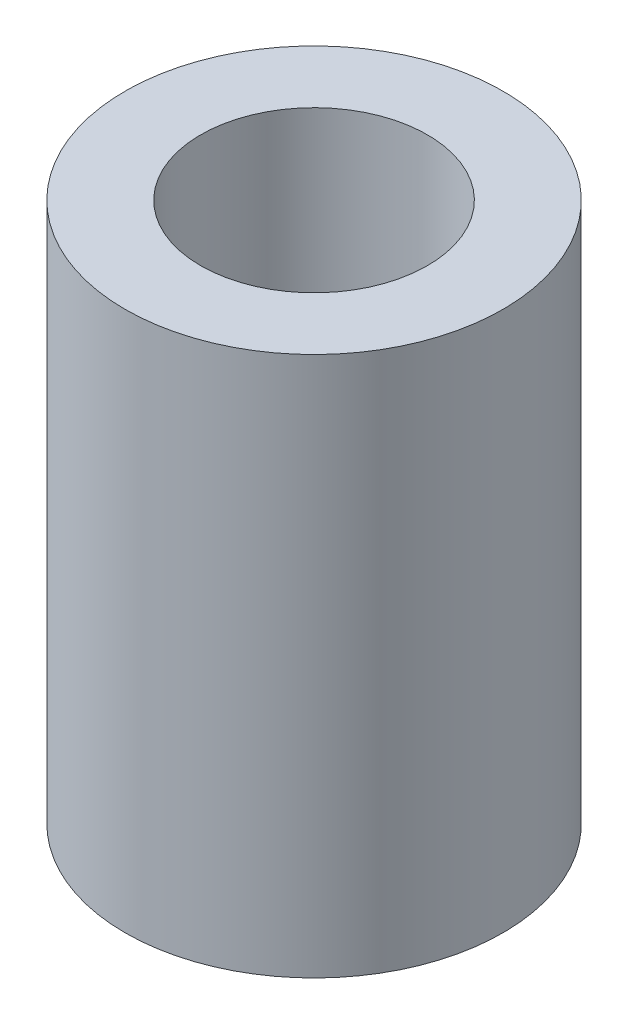
ISO-10303-21;
HEADER;
FILE_DESCRIPTION(('STEP AP214'),'2;1');
FILE_NAME('part.step','',(''),(''),'','','');
FILE_SCHEMA(('AUTOMOTIVE_DESIGN { 1 0 10303 214 1 1 1 1 }'));
ENDSEC;
DATA;
#1=APPLICATION_CONTEXT('core data for automotive mechanical design processes');
#2=APPLICATION_PROTOCOL_DEFINITION('international standard','automotive_design',2000,#1);
#3=PRODUCT_CONTEXT('',#1,'mechanical');
#4=PRODUCT('Part','Part','',(#3));
#5=PRODUCT_RELATED_PRODUCT_CATEGORY('part','',(#4));
#6=PRODUCT_DEFINITION_FORMATION('','',#4);
#7=PRODUCT_DEFINITION_CONTEXT('part definition',#1,'design');
#8=PRODUCT_DEFINITION('design','',#6,#7);
#9=PRODUCT_DEFINITION_SHAPE('','',#8);
#10=(LENGTH_UNIT() NAMED_UNIT(*) SI_UNIT(.MILLI.,.METRE.));
#11=(NAMED_UNIT(*) PLANE_ANGLE_UNIT() SI_UNIT($,.RADIAN.));
#12=(NAMED_UNIT(*) SI_UNIT($,.STERADIAN.) SOLID_ANGLE_UNIT());
#13=UNCERTAINTY_MEASURE_WITH_UNIT(LENGTH_MEASURE(1.E-05),#10,'distance_accuracy_value','');
#14=(GEOMETRIC_REPRESENTATION_CONTEXT(3) GLOBAL_UNCERTAINTY_ASSIGNED_CONTEXT((#13)) GLOBAL_UNIT_ASSIGNED_CONTEXT((#10,
#11,#12)) REPRESENTATION_CONTEXT('',''));
#15=CARTESIAN_POINT('',(0.,0.,0.));
#16=DIRECTION('',(0.,0.,1.));
#17=DIRECTION('',(1.,0.,0.));
#18=AXIS2_PLACEMENT_3D('',#15,#16,#17);
#19=CARTESIAN_POINT('',(0.,10.,0.));
#20=DIRECTION('',(0.,1.,0.));
#21=DIRECTION('',(0.,0.,1.));
#22=AXIS2_PLACEMENT_3D('',#19,#20,#21);
#23=PLANE('',#22);
#24=CARTESIAN_POINT('',(0.,10.,0.));
#25=DIRECTION('',(0.,1.,0.));
#26=DIRECTION('',(0.,0.,1.));
#27=AXIS2_PLACEMENT_3D('',#24,#25,#26);
#28=CIRCLE('',#27,3.5);
#29=CARTESIAN_POINT('',(0.,10.,3.5));
#30=VERTEX_POINT('',#29);
#31=EDGE_CURVE('E10',#30,#30,#28,.T.);
#32=ORIENTED_EDGE('',*,*,#31,.T.);
#33=EDGE_LOOP('',(#32));
#34=FACE_BOUND('',#33,.T.);
#35=CARTESIAN_POINT('',(0.,10.,0.));
#36=DIRECTION('',(0.,1.,0.));
#37=DIRECTION('',(0.,0.,1.));
#38=AXIS2_PLACEMENT_3D('',#35,#36,#37);
#39=CIRCLE('',#38,2.1);
#40=CARTESIAN_POINT('',(0.,10.,2.1));
#41=VERTEX_POINT('',#40);
#42=EDGE_CURVE('E48',#41,#41,#39,.T.);
#43=ORIENTED_EDGE('',*,*,#42,.F.);
#44=EDGE_LOOP('',(#43));
#45=FACE_BOUND('',#44,.T.);
#46=ADVANCED_FACE('F37',(#34,#45),#23,.T.);
#47=CARTESIAN_POINT('',(0.,0.,0.));
#48=DIRECTION('',(0.,1.,0.));
#49=DIRECTION('',(0.,0.,1.));
#50=AXIS2_PLACEMENT_3D('',#47,#48,#49);
#51=PLANE('',#50);
#52=CARTESIAN_POINT('',(0.,0.,0.));
#53=DIRECTION('',(0.,1.,0.));
#54=DIRECTION('',(0.,0.,1.));
#55=AXIS2_PLACEMENT_3D('',#52,#53,#54);
#56=CIRCLE('',#55,3.5);
#57=CARTESIAN_POINT('',(0.,0.,3.5));
#58=VERTEX_POINT('',#57);
#59=EDGE_CURVE('E41',#58,#58,#56,.T.);
#60=ORIENTED_EDGE('',*,*,#59,.F.);
#61=EDGE_LOOP('',(#60));
#62=FACE_BOUND('',#61,.T.);
#63=CARTESIAN_POINT('',(0.,0.,0.));
#64=DIRECTION('',(0.,1.,0.));
#65=DIRECTION('',(0.,0.,1.));
#66=AXIS2_PLACEMENT_3D('',#63,#64,#65);
#67=CIRCLE('',#66,2.1);
#68=CARTESIAN_POINT('',(0.,0.,2.1));
#69=VERTEX_POINT('',#68);
#70=EDGE_CURVE('E50',#69,#69,#67,.T.);
#71=ORIENTED_EDGE('',*,*,#70,.T.);
#72=EDGE_LOOP('',(#71));
#73=FACE_BOUND('',#72,.T.);
#74=ADVANCED_FACE('F60',(#62,#73),#51,.F.);
#75=CARTESIAN_POINT('',(0.,10.,0.));
#76=DIRECTION('',(0.,-1.,0.));
#77=DIRECTION('',(0.,0.,-1.));
#78=AXIS2_PLACEMENT_3D('',#75,#76,#77);
#79=CYLINDRICAL_SURFACE('',#78,3.5);
#80=ORIENTED_EDGE('',*,*,#31,.F.);
#81=EDGE_LOOP('',(#80));
#82=FACE_BOUND('',#81,.T.);
#83=ORIENTED_EDGE('',*,*,#59,.T.);
#84=EDGE_LOOP('',(#83));
#85=FACE_BOUND('',#84,.T.);
#86=ADVANCED_FACE('F39',(#82,#85),#79,.T.);
#87=CARTESIAN_POINT('',(0.,10.,0.));
#88=DIRECTION('',(0.,-1.,0.));
#89=DIRECTION('',(0.,0.,-1.));
#90=AXIS2_PLACEMENT_3D('',#87,#88,#89);
#91=CYLINDRICAL_SURFACE('',#90,2.1);
#92=ORIENTED_EDGE('',*,*,#42,.T.);
#93=EDGE_LOOP('',(#92));
#94=FACE_BOUND('',#93,.T.);
#95=ORIENTED_EDGE('',*,*,#70,.F.);
#96=EDGE_LOOP('',(#95));
#97=FACE_BOUND('',#96,.T.);
#98=ADVANCED_FACE('F56',(#94,#97),#91,.F.);
#99=CLOSED_SHELL('',(#46,#74,#86,#98));
#100=MANIFOLD_SOLID_BREP('B2',#99);
#101=ADVANCED_BREP_SHAPE_REPRESENTATION('',(#18,#100),#14);
#102=SHAPE_DEFINITION_REPRESENTATION(#9,#101);
ENDSEC;
END-ISO-10303-21;
